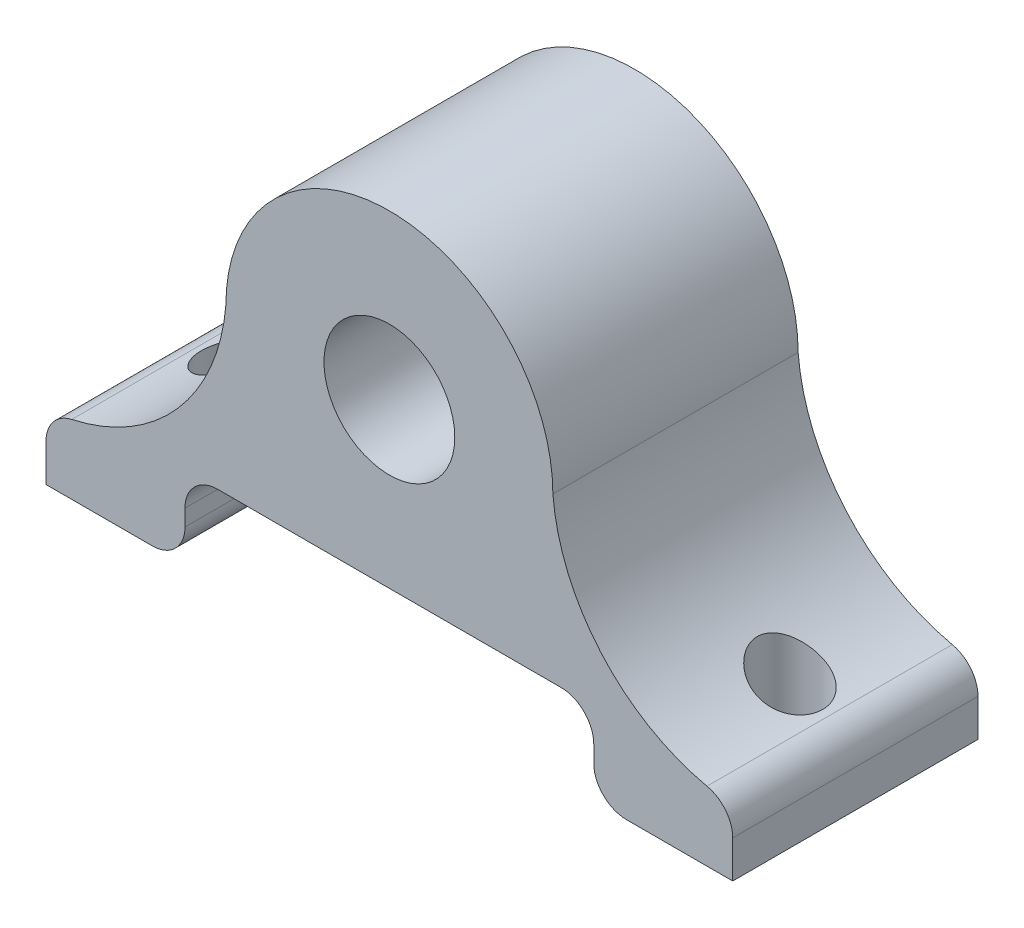
ISO-10303-21;
HEADER;
FILE_DESCRIPTION(('STEP AP214'),'2;1');
FILE_NAME('part.step','',(''),(''),'','','');
FILE_SCHEMA(('AUTOMOTIVE_DESIGN { 1 0 10303 214 1 1 1 1 }'));
ENDSEC;
DATA;
#1=APPLICATION_CONTEXT('core data for automotive mechanical design processes');
#2=APPLICATION_PROTOCOL_DEFINITION('international standard','automotive_design',2000,#1);
#3=PRODUCT_CONTEXT('',#1,'mechanical');
#4=PRODUCT('Part','Part','',(#3));
#5=PRODUCT_RELATED_PRODUCT_CATEGORY('part','',(#4));
#6=PRODUCT_DEFINITION_FORMATION('','',#4);
#7=PRODUCT_DEFINITION_CONTEXT('part definition',#1,'design');
#8=PRODUCT_DEFINITION('design','',#6,#7);
#9=PRODUCT_DEFINITION_SHAPE('','',#8);
#10=(LENGTH_UNIT() NAMED_UNIT(*) SI_UNIT(.MILLI.,.METRE.));
#11=(NAMED_UNIT(*) PLANE_ANGLE_UNIT() SI_UNIT($,.RADIAN.));
#12=(NAMED_UNIT(*) SI_UNIT($,.STERADIAN.) SOLID_ANGLE_UNIT());
#13=UNCERTAINTY_MEASURE_WITH_UNIT(LENGTH_MEASURE(1.E-05),#10,'distance_accuracy_value','');
#14=(GEOMETRIC_REPRESENTATION_CONTEXT(3) GLOBAL_UNCERTAINTY_ASSIGNED_CONTEXT((#13)) GLOBAL_UNIT_ASSIGNED_CONTEXT((#10,
#11,#12)) REPRESENTATION_CONTEXT('',''));
#15=CARTESIAN_POINT('',(0.,0.,0.));
#16=DIRECTION('',(0.,0.,1.));
#17=DIRECTION('',(1.,0.,0.));
#18=AXIS2_PLACEMENT_3D('',#15,#16,#17);
#19=CARTESIAN_POINT('',(-21.,-7.5,15.));
#20=DIRECTION('',(0.,1.,0.));
#21=DIRECTION('',(0.,0.,1.));
#22=AXIS2_PLACEMENT_3D('',#19,#20,#21);
#23=PLANE('',#22);
#24=CARTESIAN_POINT('',(17.,-7.5,7.5));
#25=DIRECTION('',(0.,1.,0.));
#26=DIRECTION('',(0.,0.,1.));
#27=AXIS2_PLACEMENT_3D('',#24,#25,#26);
#28=CIRCLE('',#27,2.);
#29=CARTESIAN_POINT('',(17.,-7.5,9.5));
#30=VERTEX_POINT('',#29);
#31=EDGE_CURVE('E163',#30,#30,#28,.F.);
#32=ORIENTED_EDGE('',*,*,#31,.F.);
#33=EDGE_LOOP('',(#32));
#34=FACE_BOUND('',#33,.T.);
#35=DIRECTION('',(1.,0.,0.));
#36=VECTOR('',#35,1.);
#37=CARTESIAN_POINT('',(-21.,-7.5,15.));
#38=LINE('',#37,#36);
#39=CARTESIAN_POINT('',(14.5,-7.5,15.));
#40=VERTEX_POINT('',#39);
#41=CARTESIAN_POINT('',(21.,-7.5,15.));
#42=VERTEX_POINT('',#41);
#43=EDGE_CURVE('E348',#40,#42,#38,.T.);
#44=ORIENTED_EDGE('',*,*,#43,.F.);
#45=DIRECTION('',(0.,0.,1.));
#46=VECTOR('',#45,1.);
#47=CARTESIAN_POINT('',(14.5,-7.5,0.));
#48=LINE('',#47,#46);
#49=CARTESIAN_POINT('',(14.5,-7.5,0.));
#50=VERTEX_POINT('',#49);
#51=EDGE_CURVE('E54',#40,#50,#48,.F.);
#52=ORIENTED_EDGE('',*,*,#51,.T.);
#53=DIRECTION('',(1.,0.,0.));
#54=VECTOR('',#53,1.);
#55=CARTESIAN_POINT('',(-21.,-7.5,0.));
#56=LINE('',#55,#54);
#57=CARTESIAN_POINT('',(21.,-7.5,0.));
#58=VERTEX_POINT('',#57);
#59=EDGE_CURVE('E357',#50,#58,#56,.T.);
#60=ORIENTED_EDGE('',*,*,#59,.T.);
#61=DIRECTION('',(0.,0.,-1.));
#62=VECTOR('',#61,1.);
#63=CARTESIAN_POINT('',(21.,-7.5,15.));
#64=LINE('',#63,#62);
#65=EDGE_CURVE('E354',#42,#58,#64,.T.);
#66=ORIENTED_EDGE('',*,*,#65,.F.);
#67=EDGE_LOOP('',(#44,#52,#60,#66));
#68=FACE_BOUND('',#67,.T.);
#69=ADVANCED_FACE('F39',(#34,#68),#23,.F.);
#70=CARTESIAN_POINT('',(-17.,-7.5,7.5));
#71=DIRECTION('',(0.,1.,0.));
#72=DIRECTION('',(0.,0.,1.));
#73=AXIS2_PLACEMENT_3D('',#70,#71,#72);
#74=CIRCLE('',#73,2.);
#75=CARTESIAN_POINT('',(-17.,-7.5,9.5));
#76=VERTEX_POINT('',#75);
#77=EDGE_CURVE('E205',#76,#76,#74,.T.);
#78=ORIENTED_EDGE('',*,*,#77,.T.);
#79=EDGE_LOOP('',(#78));
#80=FACE_BOUND('',#79,.T.);
#81=CARTESIAN_POINT('',(-21.,-7.5,0.));
#82=VERTEX_POINT('',#81);
#83=CARTESIAN_POINT('',(-14.5,-7.5,0.));
#84=VERTEX_POINT('',#83);
#85=EDGE_CURVE('E358',#82,#84,#56,.T.);
#86=ORIENTED_EDGE('',*,*,#85,.T.);
#87=DIRECTION('',(0.,0.,-1.));
#88=VECTOR('',#87,1.);
#89=CARTESIAN_POINT('',(-14.5,-7.5,15.));
#90=LINE('',#89,#88);
#91=CARTESIAN_POINT('',(-14.5,-7.5,15.));
#92=VERTEX_POINT('',#91);
#93=EDGE_CURVE('E311',#84,#92,#90,.F.);
#94=ORIENTED_EDGE('',*,*,#93,.T.);
#95=CARTESIAN_POINT('',(-21.,-7.5,15.));
#96=VERTEX_POINT('',#95);
#97=EDGE_CURVE('E349',#96,#92,#38,.T.);
#98=ORIENTED_EDGE('',*,*,#97,.F.);
#99=DIRECTION('',(0.,0.,-1.));
#100=VECTOR('',#99,1.);
#101=CARTESIAN_POINT('',(-21.,-7.5,15.));
#102=LINE('',#101,#100);
#103=EDGE_CURVE('E186',#96,#82,#102,.T.);
#104=ORIENTED_EDGE('',*,*,#103,.T.);
#105=EDGE_LOOP('',(#86,#94,#98,#104));
#106=FACE_BOUND('',#105,.T.);
#107=ADVANCED_FACE('F234',(#80,#106),#23,.F.);
#108=CARTESIAN_POINT('',(0.,7.5,15.));
#109=DIRECTION('',(0.,0.,1.));
#110=DIRECTION('',(1.,0.,0.));
#111=AXIS2_PLACEMENT_3D('',#108,#109,#110);
#112=PLANE('',#111);
#113=CARTESIAN_POINT('',(0.,7.5,15.));
#114=DIRECTION('',(0.,0.,1.));
#115=DIRECTION('',(1.,0.,0.));
#116=AXIS2_PLACEMENT_3D('',#113,#114,#115);
#117=CIRCLE('',#116,4.);
#118=CARTESIAN_POINT('',(3.99999999999999,7.5,15.));
#119=VERTEX_POINT('',#118);
#120=EDGE_CURVE('E174',#119,#119,#117,.T.);
#121=ORIENTED_EDGE('',*,*,#120,.F.);
#122=EDGE_LOOP('',(#121));
#123=FACE_BOUND('',#122,.T.);
#124=CARTESIAN_POINT('',(-21.9946159982127,8.49461599821267,15.));
#125=DIRECTION('',(0.,0.,1.));
#126=DIRECTION('',(1.,0.,0.));
#127=AXIS2_PLACEMENT_3D('',#124,#125,#126);
#128=CIRCLE('',#127,12.0357830625381);
#129=CARTESIAN_POINT('',(-10.,7.50000000000001,15.));
#130=VERTEX_POINT('',#129);
#131=CARTESIAN_POINT('',(-19.4267116390827,-3.26403788438977,15.));
#132=VERTEX_POINT('',#131);
#133=EDGE_CURVE('E193',#130,#132,#128,.F.);
#134=ORIENTED_EDGE('',*,*,#133,.T.);
#135=CARTESIAN_POINT('',(-19.,-5.21798700785008,15.));
#136=DIRECTION('',(0.,0.,1.));
#137=DIRECTION('',(1.,0.,0.));
#138=AXIS2_PLACEMENT_3D('',#135,#136,#137);
#139=CIRCLE('',#138,2.);
#140=CARTESIAN_POINT('',(-21.,-5.21798700785008,15.));
#141=VERTEX_POINT('',#140);
#142=EDGE_CURVE('E390',#132,#141,#139,.T.);
#143=ORIENTED_EDGE('',*,*,#142,.T.);
#144=DIRECTION('',(0.,-1.,0.));
#145=VECTOR('',#144,1.);
#146=CARTESIAN_POINT('',(-21.,-7.5,15.));
#147=LINE('',#146,#145);
#148=EDGE_CURVE('E346',#141,#96,#147,.T.);
#149=ORIENTED_EDGE('',*,*,#148,.T.);
#150=ORIENTED_EDGE('',*,*,#97,.T.);
#151=CARTESIAN_POINT('',(-14.5,-5.5,15.));
#152=DIRECTION('',(0.,0.,1.));
#153=DIRECTION('',(1.,0.,0.));
#154=AXIS2_PLACEMENT_3D('',#151,#152,#153);
#155=CIRCLE('',#154,2.);
#156=CARTESIAN_POINT('',(-12.5,-5.5,15.));
#157=VERTEX_POINT('',#156);
#158=EDGE_CURVE('E379',#92,#157,#155,.T.);
#159=ORIENTED_EDGE('',*,*,#158,.T.);
#160=DIRECTION('',(0.,1.,0.));
#161=VECTOR('',#160,1.);
#162=CARTESIAN_POINT('',(-12.5,-7.500012,15.));
#163=LINE('',#162,#161);
#164=CARTESIAN_POINT('',(-12.5,-4.5,15.));
#165=VERTEX_POINT('',#164);
#166=EDGE_CURVE('E324',#157,#165,#163,.T.);
#167=ORIENTED_EDGE('',*,*,#166,.T.);
#168=CARTESIAN_POINT('',(-10.5,-4.5,15.));
#169=DIRECTION('',(0.,0.,1.));
#170=DIRECTION('',(1.,0.,0.));
#171=AXIS2_PLACEMENT_3D('',#168,#169,#170);
#172=CIRCLE('',#171,2.);
#173=CARTESIAN_POINT('',(-10.5,-2.5,15.));
#174=VERTEX_POINT('',#173);
#175=EDGE_CURVE('E315',#165,#174,#172,.F.);
#176=ORIENTED_EDGE('',*,*,#175,.T.);
#177=DIRECTION('',(-1.,0.,0.));
#178=VECTOR('',#177,1.);
#179=CARTESIAN_POINT('',(-12.5,-2.5,15.));
#180=LINE('',#179,#178);
#181=CARTESIAN_POINT('',(10.5,-2.5,15.));
#182=VERTEX_POINT('',#181);
#183=EDGE_CURVE('E321',#182,#174,#180,.T.);
#184=ORIENTED_EDGE('',*,*,#183,.F.);
#185=CARTESIAN_POINT('',(10.5,-4.5,15.));
#186=DIRECTION('',(0.,0.,1.));
#187=DIRECTION('',(1.,0.,0.));
#188=AXIS2_PLACEMENT_3D('',#185,#186,#187);
#189=CIRCLE('',#188,2.);
#190=CARTESIAN_POINT('',(12.5,-4.5,15.));
#191=VERTEX_POINT('',#190);
#192=EDGE_CURVE('E47',#182,#191,#189,.F.);
#193=ORIENTED_EDGE('',*,*,#192,.T.);
#194=DIRECTION('',(0.,1.,0.));
#195=VECTOR('',#194,1.);
#196=CARTESIAN_POINT('',(12.5,-7.500012,15.));
#197=LINE('',#196,#195);
#198=CARTESIAN_POINT('',(12.5,-5.5,15.));
#199=VERTEX_POINT('',#198);
#200=EDGE_CURVE('E206',#199,#191,#197,.T.);
#201=ORIENTED_EDGE('',*,*,#200,.F.);
#202=CARTESIAN_POINT('',(14.5,-5.5,15.));
#203=DIRECTION('',(0.,0.,1.));
#204=DIRECTION('',(1.,0.,0.));
#205=AXIS2_PLACEMENT_3D('',#202,#203,#204);
#206=CIRCLE('',#205,2.);
#207=EDGE_CURVE('E380',#199,#40,#206,.T.);
#208=ORIENTED_EDGE('',*,*,#207,.T.);
#209=ORIENTED_EDGE('',*,*,#43,.T.);
#210=DIRECTION('',(0.,1.,0.));
#211=VECTOR('',#210,1.);
#212=CARTESIAN_POINT('',(21.,-7.5,15.));
#213=LINE('',#212,#211);
#214=CARTESIAN_POINT('',(21.,-5.21798700785007,15.));
#215=VERTEX_POINT('',#214);
#216=EDGE_CURVE('E352',#42,#215,#213,.T.);
#217=ORIENTED_EDGE('',*,*,#216,.T.);
#218=CARTESIAN_POINT('',(19.,-5.21798700785007,15.));
#219=DIRECTION('',(0.,0.,1.));
#220=DIRECTION('',(1.,0.,0.));
#221=AXIS2_PLACEMENT_3D('',#218,#219,#220);
#222=CIRCLE('',#221,2.);
#223=CARTESIAN_POINT('',(19.4267116390827,-3.26403788438976,15.));
#224=VERTEX_POINT('',#223);
#225=EDGE_CURVE('E383',#215,#224,#222,.T.);
#226=ORIENTED_EDGE('',*,*,#225,.T.);
#227=CARTESIAN_POINT('',(21.9946159982127,8.49461599821268,15.));
#228=DIRECTION('',(0.,0.,1.));
#229=DIRECTION('',(1.,0.,0.));
#230=AXIS2_PLACEMENT_3D('',#227,#228,#229);
#231=CIRCLE('',#230,12.0357830625381);
#232=CARTESIAN_POINT('',(9.99999999999999,7.50000000000003,15.));
#233=VERTEX_POINT('',#232);
#234=EDGE_CURVE('E191',#233,#224,#231,.T.);
#235=ORIENTED_EDGE('',*,*,#234,.F.);
#236=CARTESIAN_POINT('',(0.,7.5,15.));
#237=DIRECTION('',(0.,0.,1.));
#238=DIRECTION('',(1.,0.,0.));
#239=AXIS2_PLACEMENT_3D('',#236,#237,#238);
#240=CIRCLE('',#239,10.);
#241=EDGE_CURVE('E179',#233,#130,#240,.T.);
#242=ORIENTED_EDGE('',*,*,#241,.T.);
#243=EDGE_LOOP('',(#134,#143,#149,#150,#159,#167,#176,#184,#193,#201,#208,#209,#217,#226,#235,#242));
#244=FACE_BOUND('',#243,.T.);
#245=ADVANCED_FACE('F240',(#123,#244),#112,.T.);
#246=CARTESIAN_POINT('',(0.,7.5,0.));
#247=DIRECTION('',(0.,0.,1.));
#248=DIRECTION('',(1.,0.,0.));
#249=AXIS2_PLACEMENT_3D('',#246,#247,#248);
#250=PLANE('',#249);
#251=CARTESIAN_POINT('',(0.,7.5,0.));
#252=DIRECTION('',(0.,0.,1.));
#253=DIRECTION('',(1.,0.,0.));
#254=AXIS2_PLACEMENT_3D('',#251,#252,#253);
#255=CIRCLE('',#254,4.);
#256=CARTESIAN_POINT('',(3.99999999999999,7.5,0.));
#257=VERTEX_POINT('',#256);
#258=EDGE_CURVE('E196',#257,#257,#255,.T.);
#259=ORIENTED_EDGE('',*,*,#258,.T.);
#260=EDGE_LOOP('',(#259));
#261=FACE_BOUND('',#260,.T.);
#262=DIRECTION('',(0.,-1.,0.));
#263=VECTOR('',#262,1.);
#264=CARTESIAN_POINT('',(-21.,-7.5,0.));
#265=LINE('',#264,#263);
#266=CARTESIAN_POINT('',(-21.,-5.21798700785008,0.));
#267=VERTEX_POINT('',#266);
#268=EDGE_CURVE('E173',#267,#82,#265,.T.);
#269=ORIENTED_EDGE('',*,*,#268,.F.);
#270=CARTESIAN_POINT('',(-19.,-5.21798700785008,0.));
#271=DIRECTION('',(0.,0.,1.));
#272=DIRECTION('',(1.,0.,0.));
#273=AXIS2_PLACEMENT_3D('',#270,#271,#272);
#274=CIRCLE('',#273,2.);
#275=CARTESIAN_POINT('',(-19.4267116390827,-3.26403788438977,0.));
#276=VERTEX_POINT('',#275);
#277=EDGE_CURVE('E285',#267,#276,#274,.F.);
#278=ORIENTED_EDGE('',*,*,#277,.T.);
#279=CARTESIAN_POINT('',(-21.9946159982127,8.49461599821267,0.));
#280=DIRECTION('',(0.,0.,1.));
#281=DIRECTION('',(1.,0.,0.));
#282=AXIS2_PLACEMENT_3D('',#279,#280,#281);
#283=CIRCLE('',#282,12.0357830625381);
#284=CARTESIAN_POINT('',(-10.,7.5,0.));
#285=VERTEX_POINT('',#284);
#286=EDGE_CURVE('E162',#285,#276,#283,.F.);
#287=ORIENTED_EDGE('',*,*,#286,.F.);
#288=CARTESIAN_POINT('',(0.,7.5,0.));
#289=DIRECTION('',(0.,0.,1.));
#290=DIRECTION('',(1.,0.,0.));
#291=AXIS2_PLACEMENT_3D('',#288,#289,#290);
#292=CIRCLE('',#291,10.);
#293=CARTESIAN_POINT('',(9.99999999999999,7.5,0.));
#294=VERTEX_POINT('',#293);
#295=EDGE_CURVE('E167',#294,#285,#292,.T.);
#296=ORIENTED_EDGE('',*,*,#295,.F.);
#297=CARTESIAN_POINT('',(21.9946159982127,8.49461599821268,0.));
#298=DIRECTION('',(0.,0.,1.));
#299=DIRECTION('',(1.,0.,0.));
#300=AXIS2_PLACEMENT_3D('',#297,#298,#299);
#301=CIRCLE('',#300,12.0357830625381);
#302=CARTESIAN_POINT('',(19.4267116390827,-3.26403788438976,0.));
#303=VERTEX_POINT('',#302);
#304=EDGE_CURVE('E152',#294,#303,#301,.T.);
#305=ORIENTED_EDGE('',*,*,#304,.T.);
#306=CARTESIAN_POINT('',(19.,-5.21798700785007,0.));
#307=DIRECTION('',(0.,0.,1.));
#308=DIRECTION('',(1.,0.,0.));
#309=AXIS2_PLACEMENT_3D('',#306,#307,#308);
#310=CIRCLE('',#309,2.);
#311=CARTESIAN_POINT('',(21.,-5.21798700785007,0.));
#312=VERTEX_POINT('',#311);
#313=EDGE_CURVE('E62',#303,#312,#310,.F.);
#314=ORIENTED_EDGE('',*,*,#313,.T.);
#315=DIRECTION('',(0.,1.,0.));
#316=VECTOR('',#315,1.);
#317=CARTESIAN_POINT('',(21.,-7.5,0.));
#318=LINE('',#317,#316);
#319=EDGE_CURVE('E361',#58,#312,#318,.T.);
#320=ORIENTED_EDGE('',*,*,#319,.F.);
#321=ORIENTED_EDGE('',*,*,#59,.F.);
#322=CARTESIAN_POINT('',(14.5,-5.5,0.));
#323=DIRECTION('',(0.,0.,1.));
#324=DIRECTION('',(1.,0.,0.));
#325=AXIS2_PLACEMENT_3D('',#322,#323,#324);
#326=CIRCLE('',#325,2.);
#327=CARTESIAN_POINT('',(12.5,-5.5,0.));
#328=VERTEX_POINT('',#327);
#329=EDGE_CURVE('E278',#50,#328,#326,.F.);
#330=ORIENTED_EDGE('',*,*,#329,.T.);
#331=DIRECTION('',(0.,-1.,0.));
#332=VECTOR('',#331,1.);
#333=CARTESIAN_POINT('',(12.5,7.5,0.));
#334=LINE('',#333,#332);
#335=CARTESIAN_POINT('',(12.5,-4.5,0.));
#336=VERTEX_POINT('',#335);
#337=EDGE_CURVE('E184',#336,#328,#334,.T.);
#338=ORIENTED_EDGE('',*,*,#337,.F.);
#339=CARTESIAN_POINT('',(10.5,-4.5,0.));
#340=DIRECTION('',(0.,0.,1.));
#341=DIRECTION('',(1.,0.,0.));
#342=AXIS2_PLACEMENT_3D('',#339,#340,#341);
#343=CIRCLE('',#342,2.);
#344=CARTESIAN_POINT('',(10.5,-2.5,0.));
#345=VERTEX_POINT('',#344);
#346=EDGE_CURVE('E11',#336,#345,#343,.T.);
#347=ORIENTED_EDGE('',*,*,#346,.T.);
#348=DIRECTION('',(1.,0.,0.));
#349=VECTOR('',#348,1.);
#350=CARTESIAN_POINT('',(-12.5,-2.5,0.));
#351=LINE('',#350,#349);
#352=CARTESIAN_POINT('',(-10.5,-2.5,0.));
#353=VERTEX_POINT('',#352);
#354=EDGE_CURVE('E329',#353,#345,#351,.T.);
#355=ORIENTED_EDGE('',*,*,#354,.F.);
#356=CARTESIAN_POINT('',(-10.5,-4.5,0.));
#357=DIRECTION('',(0.,0.,1.));
#358=DIRECTION('',(1.,0.,0.));
#359=AXIS2_PLACEMENT_3D('',#356,#357,#358);
#360=CIRCLE('',#359,2.);
#361=CARTESIAN_POINT('',(-12.5,-4.5,0.));
#362=VERTEX_POINT('',#361);
#363=EDGE_CURVE('E313',#353,#362,#360,.T.);
#364=ORIENTED_EDGE('',*,*,#363,.T.);
#365=DIRECTION('',(0.,1.,0.));
#366=VECTOR('',#365,1.);
#367=CARTESIAN_POINT('',(-12.5,7.5,0.));
#368=LINE('',#367,#366);
#369=CARTESIAN_POINT('',(-12.5,-5.5,0.));
#370=VERTEX_POINT('',#369);
#371=EDGE_CURVE('E180',#370,#362,#368,.T.);
#372=ORIENTED_EDGE('',*,*,#371,.F.);
#373=CARTESIAN_POINT('',(-14.5,-5.5,0.));
#374=DIRECTION('',(0.,0.,1.));
#375=DIRECTION('',(1.,0.,0.));
#376=AXIS2_PLACEMENT_3D('',#373,#374,#375);
#377=CIRCLE('',#376,2.);
#378=EDGE_CURVE('E283',#370,#84,#377,.F.);
#379=ORIENTED_EDGE('',*,*,#378,.T.);
#380=ORIENTED_EDGE('',*,*,#85,.F.);
#381=EDGE_LOOP('',(#269,#278,#287,#296,#305,#314,#320,#321,#330,#338,#347,#355,#364,#372,#379,#380));
#382=FACE_BOUND('',#381,.T.);
#383=ADVANCED_FACE('F169',(#261,#382),#250,.F.);
#384=CARTESIAN_POINT('',(21.9946159982127,8.49461599821268,0.));
#385=DIRECTION('',(0.,0.,1.));
#386=DIRECTION('',(1.,0.,0.));
#387=AXIS2_PLACEMENT_3D('',#384,#385,#386);
#388=CYLINDRICAL_SURFACE('',#387,12.0357830625381);
#389=ORIENTED_EDGE('',*,*,#234,.T.);
#390=DIRECTION('',(0.,0.,1.));
#391=VECTOR('',#390,1.);
#392=CARTESIAN_POINT('',(19.4267116390827,-3.26403788438976,0.));
#393=LINE('',#392,#391);
#394=EDGE_CURVE('E161',#224,#303,#393,.F.);
#395=ORIENTED_EDGE('',*,*,#394,.T.);
#396=ORIENTED_EDGE('',*,*,#304,.F.);
#397=DIRECTION('',(0.,0.,-1.));
#398=VECTOR('',#397,1.);
#399=CARTESIAN_POINT('',(9.99999999999999,7.5,15.));
#400=LINE('',#399,#398);
#401=EDGE_CURVE('E158',#233,#294,#400,.T.);
#402=ORIENTED_EDGE('',*,*,#401,.F.);
#403=EDGE_LOOP('',(#389,#395,#396,#402));
#404=FACE_BOUND('',#403,.T.);
#405=CARTESIAN_POINT('',(17.,-2.45590385058345,5.50000000000001));
#406=CARTESIAN_POINT('',(16.8740826408231,-2.398468610662,5.50000335179111));
#407=CARTESIAN_POINT('',(16.7491076602525,-2.33881834405674,5.51191199928504));
#408=CARTESIAN_POINT('',(16.5046163601243,-2.2169993079408,5.55832054636973));
#409=CARTESIAN_POINT('',(16.3851066809069,-2.15482763928093,5.59284718549828));
#410=CARTESIAN_POINT('',(16.1547743783654,-2.03027999699471,5.6831693675591));
#411=CARTESIAN_POINT('',(16.0439393786477,-1.96790445177688,5.73893391745304));
#412=CARTESIAN_POINT('',(15.8334997198454,-1.84538187449669,5.87067742844975));
#413=CARTESIAN_POINT('',(15.7338993834899,-1.7852357061609,5.94666413285175));
#414=CARTESIAN_POINT('',(15.5486422903202,-1.67009922669072,6.11813220724009));
#415=CARTESIAN_POINT('',(15.4630380589339,-1.61512865184463,6.21368411336609));
#416=CARTESIAN_POINT('',(15.3100455798506,-1.5146283491432,6.42262996538312));
#417=CARTESIAN_POINT('',(15.2426172215671,-1.46907788557373,6.53598373578423));
#418=CARTESIAN_POINT('',(15.1467755342227,-1.40333785682581,6.742089428969));
#419=CARTESIAN_POINT('',(15.1127198193264,-1.37962891496102,6.83111589262329));
#420=CARTESIAN_POINT('',(15.0573752923843,-1.34082583058411,7.01483532508784));
#421=CARTESIAN_POINT('',(15.0360746434786,-1.32572370147301,7.10952295021929));
#422=CARTESIAN_POINT('',(15.0073842516826,-1.3053324862905,7.30244421391188));
#423=CARTESIAN_POINT('',(15.0000510998375,-1.30008332196761,7.40069064146793));
#424=CARTESIAN_POINT('',(14.9999494559322,-1.30001084188272,7.59720074066655));
#425=CARTESIAN_POINT('',(15.0071807506543,-1.30518737349274,7.69546441203562));
#426=CARTESIAN_POINT('',(15.0348110288429,-1.324826014683,7.88264280763828));
#427=CARTESIAN_POINT('',(15.0543415491528,-1.33867538887159,7.97175425995383));
#428=CARTESIAN_POINT('',(15.1047377763358,-1.37405121822915,8.14508430260677));
#429=CARTESIAN_POINT('',(15.1356059345708,-1.39557933362435,8.22930183024226));
#430=CARTESIAN_POINT('',(15.2098192293154,-1.44664948612565,8.39677288672979));
#431=CARTESIAN_POINT('',(15.2538659158476,-1.47663437364904,8.47957763395428));
#432=CARTESIAN_POINT('',(15.3518171531886,-1.54215486696115,8.63669564313304));
#433=CARTESIAN_POINT('',(15.4057264827086,-1.57769316229995,8.71100476024566));
#434=CARTESIAN_POINT('',(15.5313995523845,-1.65887388055198,8.86174067663568));
#435=CARTESIAN_POINT('',(15.6046409904149,-1.70522020450408,8.93655571297551));
#436=CARTESIAN_POINT('',(15.7605542308354,-1.80125445276335,9.07306283358291));
#437=CARTESIAN_POINT('',(15.8432321662572,-1.85094454156449,9.13474630783083));
#438=CARTESIAN_POINT('',(16.029905913497,-1.95984271424869,9.252983467702));
#439=CARTESIAN_POINT('',(16.1352134892028,-2.01932398466036,9.30722617700151));
#440=CARTESIAN_POINT('',(16.3537962072257,-2.13819749978726,9.39640829619527));
#441=CARTESIAN_POINT('',(16.4670751005374,-2.19758968897673,9.4313385489891));
#442=CARTESIAN_POINT('',(16.7063586630479,-2.31803513408915,9.48233522586188));
#443=CARTESIAN_POINT('',(16.8327157230082,-2.37895834013556,9.49707871468343));
#444=CARTESIAN_POINT('',(17.0879417050466,-2.49648669932657,9.50213430382928));
#445=CARTESIAN_POINT('',(17.2168100491324,-2.55309283168148,9.49245196156808));
#446=CARTESIAN_POINT('',(17.4668569221385,-2.65782818868237,9.44869440414896));
#447=CARTESIAN_POINT('',(17.5881184997735,-2.70622596345494,9.41574941112118));
#448=CARTESIAN_POINT('',(17.82440637294,-2.79632699945551,9.32654581006366));
#449=CARTESIAN_POINT('',(17.9394364958047,-2.8380344014781,9.27030170011804));
#450=CARTESIAN_POINT('',(18.1486027302202,-2.91062149415932,9.14147500771333));
#451=CARTESIAN_POINT('',(18.2436871620285,-2.9421337690119,9.07078651904996));
#452=CARTESIAN_POINT('',(18.4208498982993,-2.99872668600015,8.91254086318349));
#453=CARTESIAN_POINT('',(18.5029335891367,-3.02380999441683,8.82499071547602));
#454=CARTESIAN_POINT('',(18.6457131895171,-3.06609821967118,8.64200892523368));
#455=CARTESIAN_POINT('',(18.7074770076196,-3.08371986971932,8.54750480236241));
#456=CARTESIAN_POINT('',(18.8144679682062,-3.1135634892835,8.34878198781235));
#457=CARTESIAN_POINT('',(18.8596984278915,-3.1257865420598,8.24456525011391));
#458=CARTESIAN_POINT('',(18.9308046045859,-3.14473330509062,8.0329711734429));
#459=CARTESIAN_POINT('',(18.9572486274936,-3.15161912248357,7.92579887762511));
#460=CARTESIAN_POINT('',(18.9921598401449,-3.16066873441706,7.70837204271834));
#461=CARTESIAN_POINT('',(19.0006283613943,-3.16283287870809,7.5981177325375));
#462=CARTESIAN_POINT('',(18.9993055745994,-3.1624929052774,7.37886590912344));
#463=CARTESIAN_POINT('',(18.9897011938482,-3.16003657701193,7.26986713373036));
#464=CARTESIAN_POINT('',(18.952926472715,-3.15049262299903,7.05508688049138));
#465=CARTESIAN_POINT('',(18.9257566519316,-3.14340513424467,6.94930530757518));
#466=CARTESIAN_POINT('',(18.8547786349339,-3.12445599995478,6.74396099912414));
#467=CARTESIAN_POINT('',(18.8109736264078,-3.11259526905727,6.64439707639683));
#468=CARTESIAN_POINT('',(18.7082183447877,-3.08392003344777,6.45421188810877));
#469=CARTESIAN_POINT('',(18.6492683439431,-3.06710561778344,6.36359046183641));
#470=CARTESIAN_POINT('',(18.5176156881302,-3.02819972317614,6.19287797494541));
#471=CARTESIAN_POINT('',(18.4447912431155,-3.00606101836237,6.11289170963433));
#472=CARTESIAN_POINT('',(18.2882121462123,-2.95655750148009,5.96637336994239));
#473=CARTESIAN_POINT('',(18.2044556872262,-2.92919182502873,5.89984352459788));
#474=CARTESIAN_POINT('',(18.0263090609639,-2.86855683721147,5.77996111354194));
#475=CARTESIAN_POINT('',(17.9316894480713,-2.83514560872703,5.72702224142246));
#476=CARTESIAN_POINT('',(17.7368006320516,-2.76335246428706,5.6375767003639));
#477=CARTESIAN_POINT('',(17.63653268866,-2.72497165422693,5.6010663835961));
#478=CARTESIAN_POINT('',(17.4467535215526,-2.64926284241663,5.54838998298071));
#479=CARTESIAN_POINT('',(17.3575885243002,-2.61247559321203,5.53016179308994));
#480=CARTESIAN_POINT('',(17.1787915865363,-2.53613076349683,5.50596429631262));
#481=CARTESIAN_POINT('',(17.0891595497279,-2.49657258890029,5.49999762666413));
#482=CARTESIAN_POINT('',(17.,-2.45590385058345,5.50000000000001));
#483=B_SPLINE_CURVE_WITH_KNOTS('',3,(#405,#406,#407,#408,#409,#410,#411,#412,#413,#414,#415,
#416,#417,#418,#419,#420,#421,#422,#423,#424,#425,#426,#427,#428,#429,#430,#431,#432,#433,#434,
#435,#436,#437,#438,#439,#440,#441,#442,#443,#444,#445,#446,#447,#448,#449,#450,#451,#452,#453,
#454,#455,#456,#457,#458,#459,#460,#461,#462,#463,#464,#465,#466,#467,#468,#469,#470,#471,#472,
#473,#474,#475,#476,#477,#478,#479,#480,#481,#482),.UNSPECIFIED.,.T.,.F.,(4,2,2,2,2,2,2,2,2,2,2,
2,2,2,2,2,2,2,2,2,2,2,2,2,2,2,2,2,2,2,2,2,2,2,2,2,2,2,4),(0.,0.414824731816697,
0.830140766681476,1.24485302806297,1.65972431666953,2.07611849343728,2.49158610403998,
2.78504569064254,3.07823251933754,3.3726047247609,3.6669726207254,3.94258219824668,
4.21825140167276,4.51252817796924,4.80694791859376,5.14912608011552,5.49152791251854,
5.88747915387533,6.28361797688999,6.70464330469667,7.12557284860894,7.52734507617638,
7.92886767202932,8.29473921156224,8.66045876700376,9.00155507545755,9.34258290980401,
9.6727957725587,10.0029841744868,10.3297762097009,10.6565585786089,10.9832783599993,
11.3099922686187,11.6397185264361,11.969499358276,12.3083688476773,12.6471630566567,
12.9408289509997,13.2345580011209),.UNSPECIFIED.);
#484=CARTESIAN_POINT('',(17.,-2.45590385058345,5.50000000000001));
#485=VERTEX_POINT('',#484);
#486=EDGE_CURVE('E207',#485,#485,#483,.T.);
#487=ORIENTED_EDGE('',*,*,#486,.F.);
#488=EDGE_LOOP('',(#487));
#489=FACE_BOUND('',#488,.T.);
#490=ADVANCED_FACE('F155',(#404,#489),#388,.F.);
#491=CARTESIAN_POINT('',(-21.,-7.5,15.));
#492=DIRECTION('',(1.,0.,0.));
#493=DIRECTION('',(0.,0.,-1.));
#494=AXIS2_PLACEMENT_3D('',#491,#492,#493);
#495=PLANE('',#494);
#496=ORIENTED_EDGE('',*,*,#148,.F.);
#497=DIRECTION('',(0.,0.,-1.));
#498=VECTOR('',#497,1.);
#499=CARTESIAN_POINT('',(-21.,-5.21798700785008,0.));
#500=LINE('',#499,#498);
#501=EDGE_CURVE('E287',#141,#267,#500,.T.);
#502=ORIENTED_EDGE('',*,*,#501,.T.);
#503=ORIENTED_EDGE('',*,*,#268,.T.);
#504=ORIENTED_EDGE('',*,*,#103,.F.);
#505=EDGE_LOOP('',(#496,#502,#503,#504));
#506=FACE_BOUND('',#505,.T.);
#507=ADVANCED_FACE('F247',(#506),#495,.F.);
#508=CARTESIAN_POINT('',(0.,7.5,15.));
#509=DIRECTION('',(0.,0.,-1.));
#510=DIRECTION('',(-1.,0.,0.));
#511=AXIS2_PLACEMENT_3D('',#508,#509,#510);
#512=CYLINDRICAL_SURFACE('',#511,10.);
#513=ORIENTED_EDGE('',*,*,#295,.T.);
#514=DIRECTION('',(0.,0.,-1.));
#515=VECTOR('',#514,1.);
#516=CARTESIAN_POINT('',(-10.,7.5,15.));
#517=LINE('',#516,#515);
#518=EDGE_CURVE('E181',#130,#285,#517,.T.);
#519=ORIENTED_EDGE('',*,*,#518,.F.);
#520=ORIENTED_EDGE('',*,*,#241,.F.);
#521=ORIENTED_EDGE('',*,*,#401,.T.);
#522=EDGE_LOOP('',(#513,#519,#520,#521));
#523=FACE_BOUND('',#522,.T.);
#524=ADVANCED_FACE('F177',(#523),#512,.T.);
#525=CARTESIAN_POINT('',(21.,-7.5,15.));
#526=DIRECTION('',(-1.,0.,0.));
#527=DIRECTION('',(0.,0.,1.));
#528=AXIS2_PLACEMENT_3D('',#525,#526,#527);
#529=PLANE('',#528);
#530=ORIENTED_EDGE('',*,*,#319,.T.);
#531=DIRECTION('',(0.,0.,1.));
#532=VECTOR('',#531,1.);
#533=CARTESIAN_POINT('',(21.,-5.21798700785007,15.));
#534=LINE('',#533,#532);
#535=EDGE_CURVE('E292',#312,#215,#534,.T.);
#536=ORIENTED_EDGE('',*,*,#535,.T.);
#537=ORIENTED_EDGE('',*,*,#216,.F.);
#538=ORIENTED_EDGE('',*,*,#65,.T.);
#539=EDGE_LOOP('',(#530,#536,#537,#538));
#540=FACE_BOUND('',#539,.T.);
#541=ADVANCED_FACE('F245',(#540),#529,.F.);
#542=CARTESIAN_POINT('',(0.,7.5,0.));
#543=DIRECTION('',(0.,0.,1.));
#544=DIRECTION('',(1.,0.,0.));
#545=AXIS2_PLACEMENT_3D('',#542,#543,#544);
#546=CYLINDRICAL_SURFACE('',#545,4.);
#547=ORIENTED_EDGE('',*,*,#120,.T.);
#548=EDGE_LOOP('',(#547));
#549=FACE_BOUND('',#548,.T.);
#550=ORIENTED_EDGE('',*,*,#258,.F.);
#551=EDGE_LOOP('',(#550));
#552=FACE_BOUND('',#551,.T.);
#553=ADVANCED_FACE('F399',(#549,#552),#546,.F.);
#554=CARTESIAN_POINT('',(-21.9946159982127,8.49461599821267,0.));
#555=DIRECTION('',(0.,0.,1.));
#556=DIRECTION('',(1.,0.,0.));
#557=AXIS2_PLACEMENT_3D('',#554,#555,#556);
#558=CYLINDRICAL_SURFACE('',#557,12.0357830625381);
#559=CARTESIAN_POINT('',(-17.,-2.45590385058345,5.5));
#560=CARTESIAN_POINT('',(-17.114101686149,-2.50794787700278,5.49999970781249));
#561=CARTESIAN_POINT('',(-17.2290194257379,-2.55818961736556,5.50977432804798));
#562=CARTESIAN_POINT('',(-17.4573557127085,-2.65386551138217,5.54955451286343));
#563=CARTESIAN_POINT('',(-17.5707749216416,-2.6993018530481,5.57955082374839));
#564=CARTESIAN_POINT('',(-17.7928913309895,-2.78455920756137,5.66007492605872));
#565=CARTESIAN_POINT('',(-17.9015701116188,-2.82435946933303,5.71067606098242));
#566=CARTESIAN_POINT('',(-18.1096900763386,-2.89746886971139,5.8317478421821));
#567=CARTESIAN_POINT('',(-18.2091332197436,-2.9307793867529,5.90221426123399));
#568=CARTESIAN_POINT('',(-18.3887319548941,-2.98867750802528,6.05621438485209));
#569=CARTESIAN_POINT('',(-18.4697133729429,-3.0136860848497,6.13862737383019));
#570=CARTESIAN_POINT('',(-18.6168544938838,-3.05773073107922,6.31714409669688));
#571=CARTESIAN_POINT('',(-18.6830186163078,-3.07676858204378,6.41324373426172));
#572=CARTESIAN_POINT('',(-18.7950430715312,-3.10823002798671,6.61112467693858));
#573=CARTESIAN_POINT('',(-18.8417545568725,-3.1209372138147,6.71238011353136));
#574=CARTESIAN_POINT('',(-18.917799566476,-3.14131266365855,6.92169426805005));
#575=CARTESIAN_POINT('',(-18.947135456525,-3.14898161367458,7.02975205757922));
#576=CARTESIAN_POINT('',(-18.9869757097424,-3.15933577798434,7.24721654791901));
#577=CARTESIAN_POINT('',(-18.9978531811454,-3.16211977450462,7.35655038448759));
#578=CARTESIAN_POINT('',(-19.001570358866,-3.16307488701378,7.57554271019715));
#579=CARTESIAN_POINT('',(-18.9944109180345,-3.1612462211061,7.68520118374324));
#580=CARTESIAN_POINT('',(-18.9623817608125,-3.15295439783184,7.90113660885351));
#581=CARTESIAN_POINT('',(-18.937603669482,-3.14651521605997,8.00742809559887));
#582=CARTESIAN_POINT('',(-18.8712770299689,-3.12889449076455,8.21422153394774));
#583=CARTESIAN_POINT('',(-18.8297288444735,-3.11771304980169,8.31472361070526));
#584=CARTESIAN_POINT('',(-18.7311070707165,-3.09038280587956,8.50748595819476));
#585=CARTESIAN_POINT('',(-18.6739820396348,-3.07421752015147,8.59971755004551));
#586=CARTESIAN_POINT('',(-18.5462210070751,-3.0367786816602,8.77310615560001));
#587=CARTESIAN_POINT('',(-18.4755847297801,-3.01550502461303,8.85426294316601));
#588=CARTESIAN_POINT('',(-18.3219776479092,-2.96742406261941,9.00469622114856));
#589=CARTESIAN_POINT('',(-18.2388314316374,-2.9405355218937,9.07376736804623));
#590=CARTESIAN_POINT('',(-18.0638087990427,-2.88155867610602,9.19698911482741));
#591=CARTESIAN_POINT('',(-17.9719312083538,-2.84946967117331,9.25113770380283));
#592=CARTESIAN_POINT('',(-17.7785948855266,-2.77907972206721,9.34548226150768));
#593=CARTESIAN_POINT('',(-17.6769025463043,-2.74058579648991,9.38505405139523));
#594=CARTESIAN_POINT('',(-17.4702031439186,-2.65895390421096,9.44693610294774));
#595=CARTESIAN_POINT('',(-17.3651951299627,-2.61581459670752,9.46924136566169));
#596=CARTESIAN_POINT('',(-17.1473134174418,-2.5225847590424,9.49779642768062));
#597=CARTESIAN_POINT('',(-17.0343983105724,-2.47221977531518,9.50282822921764));
#598=CARTESIAN_POINT('',(-16.8107839672558,-2.3683111916544,9.49417458334676));
#599=CARTESIAN_POINT('',(-16.7000855189241,-2.31476648711623,9.48048259465617));
#600=CARTESIAN_POINT('',(-16.4741251997664,-2.20125002527307,9.43335949402438));
#601=CARTESIAN_POINT('',(-16.3592708191233,-2.14111800345411,9.39835488831016));
#602=CARTESIAN_POINT('',(-16.1376046770985,-2.0206792381776,9.30847890187558));
#603=CARTESIAN_POINT('',(-16.0307994192458,-1.96037239346611,9.25359165994761));
#604=CARTESIAN_POINT('',(-15.8227523033861,-1.83898847786476,9.12172998791376));
#605=CARTESIAN_POINT('',(-15.7220529680746,-1.77802280190759,9.04379113942114));
#606=CARTESIAN_POINT('',(-15.5356344539109,-1.66184377430388,8.86820505053495));
#607=CARTESIAN_POINT('',(-15.4498970613321,-1.60662346216685,8.77058208898559));
#608=CARTESIAN_POINT('',(-15.3154802582656,-1.51808049483784,8.58275524397011));
#609=CARTESIAN_POINT('',(-15.2628417099013,-1.48267889894633,8.4963576595736));
#610=CARTESIAN_POINT('',(-15.1704301024916,-1.41970138742758,8.31429141459616));
#611=CARTESIAN_POINT('',(-15.1306469629541,-1.39211934223836,8.21863009499989));
#612=CARTESIAN_POINT('',(-15.0657554907012,-1.34675423016897,8.0193707648216));
#613=CARTESIAN_POINT('',(-15.0407550495813,-1.32904325988554,7.91572049576141));
#614=CARTESIAN_POINT('',(-15.0076137990507,-1.30550191251391,7.70444987136196));
#615=CARTESIAN_POINT('',(-14.9994600555238,-1.29966242110798,7.59683262634759));
#616=CARTESIAN_POINT('',(-15.0005277698981,-1.300422788564,7.39489627533135));
#617=CARTESIAN_POINT('',(-15.0077552268688,-1.30559512115436,7.30055286320154));
#618=CARTESIAN_POINT('',(-15.0352065482855,-1.32510771118296,7.11476903106381));
#619=CARTESIAN_POINT('',(-15.0554309483002,-1.33944834642192,7.02332873084821));
#620=CARTESIAN_POINT('',(-15.1075534274038,-1.37601891343058,6.84648915368813));
#621=CARTESIAN_POINT('',(-15.1393446375799,-1.39817656648729,6.7610428530161));
#622=CARTESIAN_POINT('',(-15.2132619526243,-1.44899088966914,6.59684834427309));
#623=CARTESIAN_POINT('',(-15.255391533891,-1.47764974565442,6.51810240129612));
#624=CARTESIAN_POINT('',(-15.3545934115455,-1.54401760984317,6.35870991005465));
#625=CARTESIAN_POINT('',(-15.4128891789972,-1.58241592474037,6.27911490625424));
#626=CARTESIAN_POINT('',(-15.5390962677826,-1.66372946908391,6.13059412588998));
#627=CARTESIAN_POINT('',(-15.6070130753876,-1.70664727210048,6.06167448408036));
#628=CARTESIAN_POINT('',(-15.7633215118529,-1.80299698171769,5.92417065496195));
#629=CARTESIAN_POINT('',(-15.8532259938304,-1.85696827467311,5.85767945485079));
#630=CARTESIAN_POINT('',(-16.0420429013412,-1.96668881870042,5.74083454634661));
#631=CARTESIAN_POINT('',(-16.1409628436519,-2.02243952775461,5.69049446520693));
#632=CARTESIAN_POINT('',(-16.3623199723517,-2.14284587269908,5.60003769060188));
#633=CARTESIAN_POINT('',(-16.4859806927855,-2.2074915669171,5.56286750275511));
#634=CARTESIAN_POINT('',(-16.7394045936567,-2.33418212436966,5.51285268290585));
#635=CARTESIAN_POINT('',(-16.869165825051,-2.39622780645643,5.50000033503547));
#636=CARTESIAN_POINT('',(-17.,-2.45590385058345,5.5));
#637=B_SPLINE_CURVE_WITH_KNOTS('',3,(#559,#560,#561,#562,#563,#564,#565,#566,#567,#568,#569,
#570,#571,#572,#573,#574,#575,#576,#577,#578,#579,#580,#581,#582,#583,#584,#585,#586,#587,#588,
#589,#590,#591,#592,#593,#594,#595,#596,#597,#598,#599,#600,#601,#602,#603,#604,#605,#606,#607,
#608,#609,#610,#611,#612,#613,#614,#615,#616,#617,#618,#619,#620,#621,#622,#623,#624,#625,#626,
#627,#628,#629,#630,#631,#632,#633,#634,#635,#636),.UNSPECIFIED.,.T.,.F.,(4,2,2,2,2,2,2,2,2,2,2,
2,2,2,2,2,2,2,2,2,2,2,2,2,2,2,2,2,2,2,2,2,2,2,2,2,2,2,4),(0.,0.37578756267315,0.751403276950164,
1.12836785984456,1.50525228720288,1.85808818315346,2.21081869870047,2.5458772789458,
2.88089022855462,3.20904699784849,3.53718825098822,3.86363538351609,4.19007545634181,
4.51760694093173,4.84514511242576,5.17779880049022,5.5104972938262,5.85612830224269,
6.20185933928284,6.57151763394772,6.94130510423457,7.342409701126,7.74383498308525,
8.16526571247608,8.58617978457129,8.90646174878256,9.22649195289265,9.5488299556481,
9.87092039007693,10.1538081678598,10.4367076034268,10.7170570048012,10.9975008064357,
11.3139127348915,11.6305058248748,12.0015051126639,12.3728166070881,12.8038484779184,
13.2347435626258),.UNSPECIFIED.);
#638=CARTESIAN_POINT('',(-17.,-2.45590385058345,5.5));
#639=VERTEX_POINT('',#638);
#640=EDGE_CURVE('E197',#639,#639,#637,.T.);
#641=ORIENTED_EDGE('',*,*,#640,.F.);
#642=EDGE_LOOP('',(#641));
#643=FACE_BOUND('',#642,.T.);
#644=ORIENTED_EDGE('',*,*,#286,.T.);
#645=DIRECTION('',(0.,0.,1.));
#646=VECTOR('',#645,1.);
#647=CARTESIAN_POINT('',(-19.4267116390827,-3.26403788438977,0.));
#648=LINE('',#647,#646);
#649=EDGE_CURVE('E381',#276,#132,#648,.T.);
#650=ORIENTED_EDGE('',*,*,#649,.T.);
#651=ORIENTED_EDGE('',*,*,#133,.F.);
#652=ORIENTED_EDGE('',*,*,#518,.T.);
#653=EDGE_LOOP('',(#644,#650,#651,#652));
#654=FACE_BOUND('',#653,.T.);
#655=ADVANCED_FACE('F213',(#643,#654),#558,.F.);
#656=CARTESIAN_POINT('',(-17.,17.5,7.5));
#657=DIRECTION('',(0.,-1.,0.));
#658=DIRECTION('',(0.,0.,-1.));
#659=AXIS2_PLACEMENT_3D('',#656,#657,#658);
#660=CYLINDRICAL_SURFACE('',#659,2.);
#661=ORIENTED_EDGE('',*,*,#640,.T.);
#662=EDGE_LOOP('',(#661));
#663=FACE_BOUND('',#662,.T.);
#664=ORIENTED_EDGE('',*,*,#77,.F.);
#665=EDGE_LOOP('',(#664));
#666=FACE_BOUND('',#665,.T.);
#667=ADVANCED_FACE('F215',(#663,#666),#660,.F.);
#668=CARTESIAN_POINT('',(17.,17.5,7.5));
#669=DIRECTION('',(0.,-1.,0.));
#670=DIRECTION('',(0.,0.,-1.));
#671=AXIS2_PLACEMENT_3D('',#668,#669,#670);
#672=CYLINDRICAL_SURFACE('',#671,2.);
#673=ORIENTED_EDGE('',*,*,#486,.T.);
#674=EDGE_LOOP('',(#673));
#675=FACE_BOUND('',#674,.T.);
#676=ORIENTED_EDGE('',*,*,#31,.T.);
#677=EDGE_LOOP('',(#676));
#678=FACE_BOUND('',#677,.T.);
#679=ADVANCED_FACE('F219',(#675,#678),#672,.F.);
#680=CARTESIAN_POINT('',(12.5,-7.500012,15.));
#681=DIRECTION('',(-1.,0.,0.));
#682=DIRECTION('',(0.,0.,1.));
#683=AXIS2_PLACEMENT_3D('',#680,#681,#682);
#684=PLANE('',#683);
#685=ORIENTED_EDGE('',*,*,#200,.T.);
#686=DIRECTION('',(0.,0.,1.));
#687=VECTOR('',#686,1.);
#688=CARTESIAN_POINT('',(12.5,-4.5,0.));
#689=LINE('',#688,#687);
#690=EDGE_CURVE('E308',#191,#336,#689,.F.);
#691=ORIENTED_EDGE('',*,*,#690,.T.);
#692=ORIENTED_EDGE('',*,*,#337,.T.);
#693=DIRECTION('',(0.,0.,1.));
#694=VECTOR('',#693,1.);
#695=CARTESIAN_POINT('',(12.5,-5.5,15.));
#696=LINE('',#695,#694);
#697=EDGE_CURVE('E280',#328,#199,#696,.T.);
#698=ORIENTED_EDGE('',*,*,#697,.T.);
#699=EDGE_LOOP('',(#685,#691,#692,#698));
#700=FACE_BOUND('',#699,.T.);
#701=ADVANCED_FACE('F221',(#700),#684,.T.);
#702=CARTESIAN_POINT('',(-12.5,-7.500012,15.));
#703=DIRECTION('',(1.,0.,0.));
#704=DIRECTION('',(0.,0.,-1.));
#705=AXIS2_PLACEMENT_3D('',#702,#703,#704);
#706=PLANE('',#705);
#707=ORIENTED_EDGE('',*,*,#371,.T.);
#708=DIRECTION('',(0.,0.,-1.));
#709=VECTOR('',#708,1.);
#710=CARTESIAN_POINT('',(-12.5,-4.5,15.));
#711=LINE('',#710,#709);
#712=EDGE_CURVE('E305',#362,#165,#711,.F.);
#713=ORIENTED_EDGE('',*,*,#712,.T.);
#714=ORIENTED_EDGE('',*,*,#166,.F.);
#715=DIRECTION('',(0.,0.,-1.));
#716=VECTOR('',#715,1.);
#717=CARTESIAN_POINT('',(-12.5,-5.5,0.));
#718=LINE('',#717,#716);
#719=EDGE_CURVE('E302',#157,#370,#718,.T.);
#720=ORIENTED_EDGE('',*,*,#719,.T.);
#721=EDGE_LOOP('',(#707,#713,#714,#720));
#722=FACE_BOUND('',#721,.T.);
#723=ADVANCED_FACE('F230',(#722),#706,.T.);
#724=CARTESIAN_POINT('',(0.,-2.5,0.));
#725=DIRECTION('',(0.,-1.,0.));
#726=DIRECTION('',(0.,0.,-1.));
#727=AXIS2_PLACEMENT_3D('',#724,#725,#726);
#728=PLANE('',#727);
#729=ORIENTED_EDGE('',*,*,#183,.T.);
#730=DIRECTION('',(0.,0.,-1.));
#731=VECTOR('',#730,1.);
#732=CARTESIAN_POINT('',(-10.5,-2.5,0.));
#733=LINE('',#732,#731);
#734=EDGE_CURVE('E299',#174,#353,#733,.T.);
#735=ORIENTED_EDGE('',*,*,#734,.T.);
#736=ORIENTED_EDGE('',*,*,#354,.T.);
#737=DIRECTION('',(0.,0.,1.));
#738=VECTOR('',#737,1.);
#739=CARTESIAN_POINT('',(10.5,-2.5,15.));
#740=LINE('',#739,#738);
#741=EDGE_CURVE('E296',#345,#182,#740,.T.);
#742=ORIENTED_EDGE('',*,*,#741,.T.);
#743=EDGE_LOOP('',(#729,#735,#736,#742));
#744=FACE_BOUND('',#743,.T.);
#745=ADVANCED_FACE('F257',(#744),#728,.T.);
#746=CARTESIAN_POINT('',(-19.,-5.21798700785008,0.));
#747=DIRECTION('',(0.,0.,1.));
#748=DIRECTION('',(1.,0.,0.));
#749=AXIS2_PLACEMENT_3D('',#746,#747,#748);
#750=CYLINDRICAL_SURFACE('',#749,2.);
#751=ORIENTED_EDGE('',*,*,#277,.F.);
#752=ORIENTED_EDGE('',*,*,#501,.F.);
#753=ORIENTED_EDGE('',*,*,#142,.F.);
#754=ORIENTED_EDGE('',*,*,#649,.F.);
#755=EDGE_LOOP('',(#751,#752,#753,#754));
#756=FACE_BOUND('',#755,.T.);
#757=ADVANCED_FACE('F253',(#756),#750,.T.);
#758=CARTESIAN_POINT('',(19.,-5.21798700785007,0.));
#759=DIRECTION('',(0.,0.,1.));
#760=DIRECTION('',(1.,0.,0.));
#761=AXIS2_PLACEMENT_3D('',#758,#759,#760);
#762=CYLINDRICAL_SURFACE('',#761,2.);
#763=ORIENTED_EDGE('',*,*,#313,.F.);
#764=ORIENTED_EDGE('',*,*,#394,.F.);
#765=ORIENTED_EDGE('',*,*,#225,.F.);
#766=ORIENTED_EDGE('',*,*,#535,.F.);
#767=EDGE_LOOP('',(#763,#764,#765,#766));
#768=FACE_BOUND('',#767,.T.);
#769=ADVANCED_FACE('F256',(#768),#762,.T.);
#770=CARTESIAN_POINT('',(-10.5,-4.5,0.));
#771=DIRECTION('',(0.,0.,1.));
#772=DIRECTION('',(1.,0.,0.));
#773=AXIS2_PLACEMENT_3D('',#770,#771,#772);
#774=CYLINDRICAL_SURFACE('',#773,2.);
#775=ORIENTED_EDGE('',*,*,#175,.F.);
#776=ORIENTED_EDGE('',*,*,#712,.F.);
#777=ORIENTED_EDGE('',*,*,#363,.F.);
#778=ORIENTED_EDGE('',*,*,#734,.F.);
#779=EDGE_LOOP('',(#775,#776,#777,#778));
#780=FACE_BOUND('',#779,.T.);
#781=ADVANCED_FACE('F261',(#780),#774,.F.);
#782=CARTESIAN_POINT('',(10.5,-4.5,0.));
#783=DIRECTION('',(0.,0.,-1.));
#784=DIRECTION('',(-1.,0.,0.));
#785=AXIS2_PLACEMENT_3D('',#782,#783,#784);
#786=CYLINDRICAL_SURFACE('',#785,2.);
#787=ORIENTED_EDGE('',*,*,#346,.F.);
#788=ORIENTED_EDGE('',*,*,#690,.F.);
#789=ORIENTED_EDGE('',*,*,#192,.F.);
#790=ORIENTED_EDGE('',*,*,#741,.F.);
#791=EDGE_LOOP('',(#787,#788,#789,#790));
#792=FACE_BOUND('',#791,.T.);
#793=ADVANCED_FACE('F265',(#792),#786,.F.);
#794=CARTESIAN_POINT('',(14.5,-5.5,15.));
#795=DIRECTION('',(0.,0.,-1.));
#796=DIRECTION('',(-1.,0.,0.));
#797=AXIS2_PLACEMENT_3D('',#794,#795,#796);
#798=CYLINDRICAL_SURFACE('',#797,2.);
#799=ORIENTED_EDGE('',*,*,#329,.F.);
#800=ORIENTED_EDGE('',*,*,#51,.F.);
#801=ORIENTED_EDGE('',*,*,#207,.F.);
#802=ORIENTED_EDGE('',*,*,#697,.F.);
#803=EDGE_LOOP('',(#799,#800,#801,#802));
#804=FACE_BOUND('',#803,.T.);
#805=ADVANCED_FACE('F268',(#804),#798,.T.);
#806=CARTESIAN_POINT('',(-14.5,-5.5,15.));
#807=DIRECTION('',(0.,0.,1.));
#808=DIRECTION('',(1.,0.,0.));
#809=AXIS2_PLACEMENT_3D('',#806,#807,#808);
#810=CYLINDRICAL_SURFACE('',#809,2.);
#811=ORIENTED_EDGE('',*,*,#158,.F.);
#812=ORIENTED_EDGE('',*,*,#93,.F.);
#813=ORIENTED_EDGE('',*,*,#378,.F.);
#814=ORIENTED_EDGE('',*,*,#719,.F.);
#815=EDGE_LOOP('',(#811,#812,#813,#814));
#816=FACE_BOUND('',#815,.T.);
#817=ADVANCED_FACE('F41',(#816),#810,.T.);
#818=CLOSED_SHELL('',(#69,#107,#245,#383,#490,#507,#524,#541,#553,#655,#667,#679,#701,#723,#745,
#757,#769,#781,#793,#805,#817));
#819=MANIFOLD_SOLID_BREP('B2',#818);
#820=ADVANCED_BREP_SHAPE_REPRESENTATION('',(#18,#819),#14);
#821=SHAPE_DEFINITION_REPRESENTATION(#9,#820);
ENDSEC;
END-ISO-10303-21;
